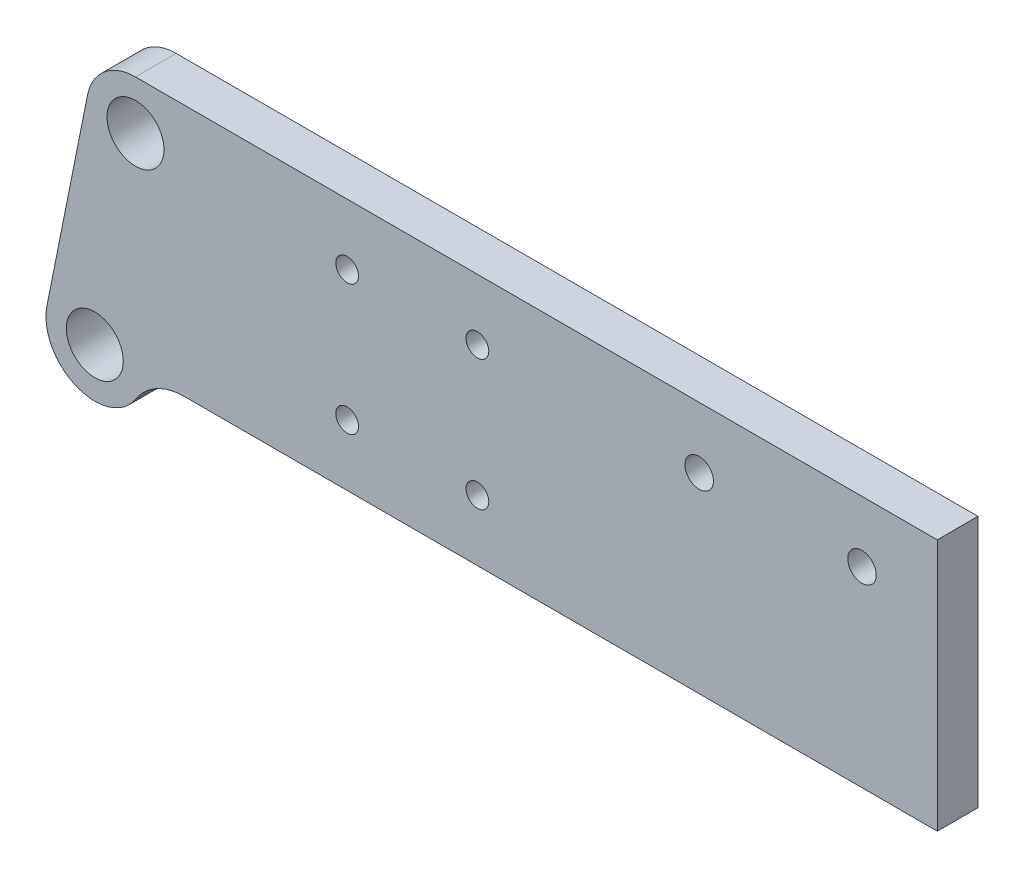
ISO-10303-21;
HEADER;
FILE_DESCRIPTION(('STEP AP214'),'2;1');
FILE_NAME('part.step','',(''),(''),'','','');
FILE_SCHEMA(('AUTOMOTIVE_DESIGN { 1 0 10303 214 1 1 1 1 }'));
ENDSEC;
DATA;
#1=APPLICATION_CONTEXT('core data for automotive mechanical design processes');
#2=APPLICATION_PROTOCOL_DEFINITION('international standard','automotive_design',2000,#1);
#3=PRODUCT_CONTEXT('',#1,'mechanical');
#4=PRODUCT('Part','Part','',(#3));
#5=PRODUCT_RELATED_PRODUCT_CATEGORY('part','',(#4));
#6=PRODUCT_DEFINITION_FORMATION('','',#4);
#7=PRODUCT_DEFINITION_CONTEXT('part definition',#1,'design');
#8=PRODUCT_DEFINITION('design','',#6,#7);
#9=PRODUCT_DEFINITION_SHAPE('','',#8);
#10=(LENGTH_UNIT() NAMED_UNIT(*) SI_UNIT(.MILLI.,.METRE.));
#11=(NAMED_UNIT(*) PLANE_ANGLE_UNIT() SI_UNIT($,.RADIAN.));
#12=(NAMED_UNIT(*) SI_UNIT($,.STERADIAN.) SOLID_ANGLE_UNIT());
#13=UNCERTAINTY_MEASURE_WITH_UNIT(LENGTH_MEASURE(1.E-05),#10,'distance_accuracy_value','');
#14=(GEOMETRIC_REPRESENTATION_CONTEXT(3) GLOBAL_UNCERTAINTY_ASSIGNED_CONTEXT((#13)) GLOBAL_UNIT_ASSIGNED_CONTEXT((#10,
#11,#12)) REPRESENTATION_CONTEXT('',''));
#15=CARTESIAN_POINT('',(0.,0.,0.));
#16=DIRECTION('',(0.,0.,1.));
#17=DIRECTION('',(1.,0.,0.));
#18=AXIS2_PLACEMENT_3D('',#15,#16,#17);
#19=CARTESIAN_POINT('',(64.5,-15.5,-5.));
#20=DIRECTION('',(1.,0.,0.));
#21=DIRECTION('',(0.,0.,-1.));
#22=AXIS2_PLACEMENT_3D('',#19,#20,#21);
#23=PLANE('',#22);
#24=DIRECTION('',(0.,1.,0.));
#25=VECTOR('',#24,1.);
#26=CARTESIAN_POINT('',(64.5,-15.5,0.));
#27=LINE('',#26,#25);
#28=CARTESIAN_POINT('',(64.5,-15.5,0.));
#29=VERTEX_POINT('',#28);
#30=CARTESIAN_POINT('',(64.5,15.5,0.));
#31=VERTEX_POINT('',#30);
#32=EDGE_CURVE('E126',#29,#31,#27,.T.);
#33=ORIENTED_EDGE('',*,*,#32,.F.);
#34=DIRECTION('',(0.,0.,1.));
#35=VECTOR('',#34,1.);
#36=CARTESIAN_POINT('',(64.5,-15.5,-5.));
#37=LINE('',#36,#35);
#38=CARTESIAN_POINT('',(64.5,-15.5,-5.));
#39=VERTEX_POINT('',#38);
#40=EDGE_CURVE('E11',#39,#29,#37,.T.);
#41=ORIENTED_EDGE('',*,*,#40,.F.);
#42=DIRECTION('',(0.,1.,0.));
#43=VECTOR('',#42,1.);
#44=CARTESIAN_POINT('',(64.5,-15.5,-5.));
#45=LINE('',#44,#43);
#46=CARTESIAN_POINT('',(64.5,15.5,-5.));
#47=VERTEX_POINT('',#46);
#48=EDGE_CURVE('E144',#39,#47,#45,.T.);
#49=ORIENTED_EDGE('',*,*,#48,.T.);
#50=DIRECTION('',(0.,0.,1.));
#51=VECTOR('',#50,1.);
#52=CARTESIAN_POINT('',(64.5,15.5,-5.));
#53=LINE('',#52,#51);
#54=EDGE_CURVE('E38',#47,#31,#53,.T.);
#55=ORIENTED_EDGE('',*,*,#54,.T.);
#56=EDGE_LOOP('',(#33,#41,#49,#55));
#57=FACE_BOUND('',#56,.T.);
#58=ADVANCED_FACE('F35',(#57),#23,.T.);
#59=CARTESIAN_POINT('',(-28.0455488498967,-15.5,-5.));
#60=DIRECTION('',(0.,-1.,0.));
#61=DIRECTION('',(1.,0.,0.));
#62=AXIS2_PLACEMENT_3D('',#59,#60,#61);
#63=PLANE('',#62);
#64=DIRECTION('',(1.,0.,0.));
#65=VECTOR('',#64,1.);
#66=CARTESIAN_POINT('',(-28.0455488498967,-15.5,0.));
#67=LINE('',#66,#65);
#68=CARTESIAN_POINT('',(-28.0455488498967,-15.5,0.));
#69=VERTEX_POINT('',#68);
#70=EDGE_CURVE('E142',#69,#29,#67,.T.);
#71=ORIENTED_EDGE('',*,*,#70,.F.);
#72=DIRECTION('',(0.,0.,1.));
#73=VECTOR('',#72,1.);
#74=CARTESIAN_POINT('',(-28.0455488498967,-15.5,-5.));
#75=LINE('',#74,#73);
#76=CARTESIAN_POINT('',(-28.0455488498967,-15.5,-5.));
#77=VERTEX_POINT('',#76);
#78=EDGE_CURVE('E44',#77,#69,#75,.T.);
#79=ORIENTED_EDGE('',*,*,#78,.F.);
#80=DIRECTION('',(1.,0.,0.));
#81=VECTOR('',#80,1.);
#82=CARTESIAN_POINT('',(-28.0455488498967,-15.5,-5.));
#83=LINE('',#82,#81);
#84=EDGE_CURVE('E116',#77,#39,#83,.T.);
#85=ORIENTED_EDGE('',*,*,#84,.T.);
#86=ORIENTED_EDGE('',*,*,#40,.T.);
#87=EDGE_LOOP('',(#71,#79,#85,#86));
#88=FACE_BOUND('',#87,.T.);
#89=ADVANCED_FACE('F154',(#88),#63,.T.);
#90=CARTESIAN_POINT('',(-28.0455488498967,-22.5,-5.));
#91=DIRECTION('',(0.,0.,1.));
#92=DIRECTION('',(1.,0.,0.));
#93=AXIS2_PLACEMENT_3D('',#90,#91,#92);
#94=CYLINDRICAL_SURFACE('',#93,7.);
#95=CARTESIAN_POINT('',(-28.0455488498967,-22.5,0.));
#96=DIRECTION('',(0.,0.,-1.));
#97=DIRECTION('',(1.,0.,0.));
#98=AXIS2_PLACEMENT_3D('',#95,#96,#97);
#99=CIRCLE('',#98,7.);
#100=CARTESIAN_POINT('',(-33.9440994691831,-18.7307692307692,0.));
#101=VERTEX_POINT('',#100);
#102=EDGE_CURVE('E103',#101,#69,#99,.T.);
#103=ORIENTED_EDGE('',*,*,#102,.F.);
#104=DIRECTION('',(0.,0.,1.));
#105=VECTOR('',#104,1.);
#106=CARTESIAN_POINT('',(-33.9440994691831,-18.7307692307692,-5.));
#107=LINE('',#106,#105);
#108=CARTESIAN_POINT('',(-33.9440994691831,-18.7307692307692,-5.));
#109=VERTEX_POINT('',#108);
#110=EDGE_CURVE('E98',#109,#101,#107,.T.);
#111=ORIENTED_EDGE('',*,*,#110,.F.);
#112=CARTESIAN_POINT('',(-28.0455488498967,-22.5,-5.));
#113=DIRECTION('',(0.,0.,-1.));
#114=DIRECTION('',(1.,0.,0.));
#115=AXIS2_PLACEMENT_3D('',#112,#113,#114);
#116=CIRCLE('',#115,7.);
#117=EDGE_CURVE('E101',#109,#77,#116,.T.);
#118=ORIENTED_EDGE('',*,*,#117,.T.);
#119=ORIENTED_EDGE('',*,*,#78,.T.);
#120=EDGE_LOOP('',(#103,#111,#118,#119));
#121=FACE_BOUND('',#120,.T.);
#122=ADVANCED_FACE('F100',(#121),#94,.F.);
#123=CARTESIAN_POINT('',(-39.,-15.5,-5.));
#124=DIRECTION('',(0.,0.,1.));
#125=DIRECTION('',(1.,0.,0.));
#126=AXIS2_PLACEMENT_3D('',#123,#124,#125);
#127=CYLINDRICAL_SURFACE('',#126,6.);
#128=CARTESIAN_POINT('',(-39.,-15.5,0.));
#129=DIRECTION('',(0.,0.,1.));
#130=DIRECTION('',(-1.,0.,0.));
#131=AXIS2_PLACEMENT_3D('',#128,#129,#130);
#132=CIRCLE('',#131,6.);
#133=CARTESIAN_POINT('',(-44.8834840541455,-14.3233031891709,0.));
#134=VERTEX_POINT('',#133);
#135=EDGE_CURVE('E139',#134,#101,#132,.T.);
#136=ORIENTED_EDGE('',*,*,#135,.F.);
#137=DIRECTION('',(0.,0.,1.));
#138=VECTOR('',#137,1.);
#139=CARTESIAN_POINT('',(-44.8834840541455,-14.3233031891709,-5.));
#140=LINE('',#139,#138);
#141=CARTESIAN_POINT('',(-44.8834840541455,-14.3233031891709,-5.));
#142=VERTEX_POINT('',#141);
#143=EDGE_CURVE('E108',#142,#134,#140,.T.);
#144=ORIENTED_EDGE('',*,*,#143,.F.);
#145=CARTESIAN_POINT('',(-39.,-15.5,-5.));
#146=DIRECTION('',(0.,0.,1.));
#147=DIRECTION('',(-1.,0.,0.));
#148=AXIS2_PLACEMENT_3D('',#145,#146,#147);
#149=CIRCLE('',#148,6.);
#150=EDGE_CURVE('E114',#142,#109,#149,.T.);
#151=ORIENTED_EDGE('',*,*,#150,.T.);
#152=ORIENTED_EDGE('',*,*,#110,.T.);
#153=EDGE_LOOP('',(#136,#144,#151,#152));
#154=FACE_BOUND('',#153,.T.);
#155=ADVANCED_FACE('F118',(#154),#127,.T.);
#156=CARTESIAN_POINT('',(-44.8834840541455,-14.3233031891709,-5.));
#157=DIRECTION('',(-0.98058067569092,0.196116135138184,0.));
#158=DIRECTION('',(-0.196116135138184,-0.98058067569092,0.));
#159=AXIS2_PLACEMENT_3D('',#156,#157,#158);
#160=PLANE('',#159);
#161=DIRECTION('',(-0.196116135138184,-0.98058067569092,0.));
#162=VECTOR('',#161,1.);
#163=CARTESIAN_POINT('',(-44.8834840541455,-14.3233031891709,0.));
#164=LINE('',#163,#162);
#165=CARTESIAN_POINT('',(-39.8834840541455,10.6766968108291,0.));
#166=VERTEX_POINT('',#165);
#167=EDGE_CURVE('E136',#166,#134,#164,.T.);
#168=ORIENTED_EDGE('',*,*,#167,.F.);
#169=DIRECTION('',(0.,0.,1.));
#170=VECTOR('',#169,1.);
#171=CARTESIAN_POINT('',(-39.8834840541455,10.6766968108291,-5.));
#172=LINE('',#171,#170);
#173=CARTESIAN_POINT('',(-39.8834840541455,10.6766968108291,-5.));
#174=VERTEX_POINT('',#173);
#175=EDGE_CURVE('E148',#174,#166,#172,.T.);
#176=ORIENTED_EDGE('',*,*,#175,.F.);
#177=DIRECTION('',(-0.196116135138184,-0.98058067569092,0.));
#178=VECTOR('',#177,1.);
#179=CARTESIAN_POINT('',(-44.8834840541455,-14.3233031891709,-5.));
#180=LINE('',#179,#178);
#181=EDGE_CURVE('E119',#174,#142,#180,.T.);
#182=ORIENTED_EDGE('',*,*,#181,.T.);
#183=ORIENTED_EDGE('',*,*,#143,.T.);
#184=EDGE_LOOP('',(#168,#176,#182,#183));
#185=FACE_BOUND('',#184,.T.);
#186=ADVANCED_FACE('F167',(#185),#160,.T.);
#187=CARTESIAN_POINT('',(-34.,9.5,-5.));
#188=DIRECTION('',(0.,0.,1.));
#189=DIRECTION('',(1.,0.,0.));
#190=AXIS2_PLACEMENT_3D('',#187,#188,#189);
#191=CYLINDRICAL_SURFACE('',#190,6.);
#192=CARTESIAN_POINT('',(-34.,9.5,0.));
#193=DIRECTION('',(0.,0.,1.));
#194=DIRECTION('',(1.,0.,0.));
#195=AXIS2_PLACEMENT_3D('',#192,#193,#194);
#196=CIRCLE('',#195,6.);
#197=CARTESIAN_POINT('',(-34.,15.5,0.));
#198=VERTEX_POINT('',#197);
#199=EDGE_CURVE('E133',#198,#166,#196,.T.);
#200=ORIENTED_EDGE('',*,*,#199,.F.);
#201=DIRECTION('',(0.,0.,1.));
#202=VECTOR('',#201,1.);
#203=CARTESIAN_POINT('',(-34.,15.5,-5.));
#204=LINE('',#203,#202);
#205=CARTESIAN_POINT('',(-34.,15.5,-5.));
#206=VERTEX_POINT('',#205);
#207=EDGE_CURVE('E149',#206,#198,#204,.T.);
#208=ORIENTED_EDGE('',*,*,#207,.F.);
#209=CARTESIAN_POINT('',(-34.,9.5,-5.));
#210=DIRECTION('',(0.,0.,1.));
#211=DIRECTION('',(1.,0.,0.));
#212=AXIS2_PLACEMENT_3D('',#209,#210,#211);
#213=CIRCLE('',#212,6.);
#214=EDGE_CURVE('E121',#206,#174,#213,.T.);
#215=ORIENTED_EDGE('',*,*,#214,.T.);
#216=ORIENTED_EDGE('',*,*,#175,.T.);
#217=EDGE_LOOP('',(#200,#208,#215,#216));
#218=FACE_BOUND('',#217,.T.);
#219=ADVANCED_FACE('F170',(#218),#191,.T.);
#220=CARTESIAN_POINT('',(-34.,15.5,-5.));
#221=DIRECTION('',(0.,1.,0.));
#222=DIRECTION('',(-1.,0.,0.));
#223=AXIS2_PLACEMENT_3D('',#220,#221,#222);
#224=PLANE('',#223);
#225=DIRECTION('',(-1.,0.,0.));
#226=VECTOR('',#225,1.);
#227=CARTESIAN_POINT('',(-34.,15.5,0.));
#228=LINE('',#227,#226);
#229=EDGE_CURVE('E129',#31,#198,#228,.T.);
#230=ORIENTED_EDGE('',*,*,#229,.F.);
#231=ORIENTED_EDGE('',*,*,#54,.F.);
#232=DIRECTION('',(-1.,0.,0.));
#233=VECTOR('',#232,1.);
#234=CARTESIAN_POINT('',(-34.,15.5,-5.));
#235=LINE('',#234,#233);
#236=EDGE_CURVE('E270',#47,#206,#235,.T.);
#237=ORIENTED_EDGE('',*,*,#236,.T.);
#238=ORIENTED_EDGE('',*,*,#207,.T.);
#239=EDGE_LOOP('',(#230,#231,#237,#238));
#240=FACE_BOUND('',#239,.T.);
#241=ADVANCED_FACE('F151',(#240),#224,.T.);
#242=CARTESIAN_POINT('',(-34.,9.5,-5.));
#243=DIRECTION('',(0.,0.,1.));
#244=DIRECTION('',(1.,0.,0.));
#245=AXIS2_PLACEMENT_3D('',#242,#243,#244);
#246=PLANE('',#245);
#247=CARTESIAN_POINT('',(55.25,8.,-5.));
#248=DIRECTION('',(0.,0.,1.));
#249=DIRECTION('',(1.,0.,0.));
#250=AXIS2_PLACEMENT_3D('',#247,#248,#249);
#251=CIRCLE('',#250,1.75);
#252=CARTESIAN_POINT('',(57.,8.,-5.));
#253=VERTEX_POINT('',#252);
#254=EDGE_CURVE('E221',#253,#253,#251,.T.);
#255=ORIENTED_EDGE('',*,*,#254,.T.);
#256=EDGE_LOOP('',(#255));
#257=FACE_BOUND('',#256,.T.);
#258=CARTESIAN_POINT('',(35.25,8.,-5.));
#259=DIRECTION('',(0.,0.,1.));
#260=DIRECTION('',(1.,0.,0.));
#261=AXIS2_PLACEMENT_3D('',#258,#259,#260);
#262=CIRCLE('',#261,1.75);
#263=CARTESIAN_POINT('',(37.,8.,-5.));
#264=VERTEX_POINT('',#263);
#265=EDGE_CURVE('E229',#264,#264,#262,.T.);
#266=ORIENTED_EDGE('',*,*,#265,.T.);
#267=EDGE_LOOP('',(#266));
#268=FACE_BOUND('',#267,.T.);
#269=CARTESIAN_POINT('',(-34.,9.5,-5.));
#270=DIRECTION('',(0.,0.,1.));
#271=DIRECTION('',(1.,0.,0.));
#272=AXIS2_PLACEMENT_3D('',#269,#270,#271);
#273=CIRCLE('',#272,3.5);
#274=CARTESIAN_POINT('',(-30.5,9.5,-5.));
#275=VERTEX_POINT('',#274);
#276=EDGE_CURVE('E235',#275,#275,#273,.T.);
#277=ORIENTED_EDGE('',*,*,#276,.T.);
#278=EDGE_LOOP('',(#277));
#279=FACE_BOUND('',#278,.T.);
#280=CARTESIAN_POINT('',(-39.,-15.5,-5.));
#281=DIRECTION('',(0.,0.,1.));
#282=DIRECTION('',(1.,0.,0.));
#283=AXIS2_PLACEMENT_3D('',#280,#281,#282);
#284=CIRCLE('',#283,3.5);
#285=CARTESIAN_POINT('',(-35.5,-15.5,-5.));
#286=VERTEX_POINT('',#285);
#287=EDGE_CURVE('E241',#286,#286,#284,.T.);
#288=ORIENTED_EDGE('',*,*,#287,.T.);
#289=EDGE_LOOP('',(#288));
#290=FACE_BOUND('',#289,.T.);
#291=CARTESIAN_POINT('',(-8.,-8.,-5.));
#292=DIRECTION('',(0.,0.,1.));
#293=DIRECTION('',(1.,0.,0.));
#294=AXIS2_PLACEMENT_3D('',#291,#292,#293);
#295=CIRCLE('',#294,1.4);
#296=CARTESIAN_POINT('',(-6.6,-8.,-5.));
#297=VERTEX_POINT('',#296);
#298=EDGE_CURVE('E247',#297,#297,#295,.T.);
#299=ORIENTED_EDGE('',*,*,#298,.T.);
#300=EDGE_LOOP('',(#299));
#301=FACE_BOUND('',#300,.T.);
#302=CARTESIAN_POINT('',(8.,-8.,-5.));
#303=DIRECTION('',(0.,0.,1.));
#304=DIRECTION('',(1.,0.,0.));
#305=AXIS2_PLACEMENT_3D('',#302,#303,#304);
#306=CIRCLE('',#305,1.4);
#307=CARTESIAN_POINT('',(9.4,-8.,-5.));
#308=VERTEX_POINT('',#307);
#309=EDGE_CURVE('E253',#308,#308,#306,.T.);
#310=ORIENTED_EDGE('',*,*,#309,.T.);
#311=EDGE_LOOP('',(#310));
#312=FACE_BOUND('',#311,.T.);
#313=CARTESIAN_POINT('',(8.,8.,-5.));
#314=DIRECTION('',(0.,0.,1.));
#315=DIRECTION('',(1.,0.,0.));
#316=AXIS2_PLACEMENT_3D('',#313,#314,#315);
#317=CIRCLE('',#316,1.4);
#318=CARTESIAN_POINT('',(9.4,8.,-5.));
#319=VERTEX_POINT('',#318);
#320=EDGE_CURVE('E259',#319,#319,#317,.T.);
#321=ORIENTED_EDGE('',*,*,#320,.T.);
#322=EDGE_LOOP('',(#321));
#323=FACE_BOUND('',#322,.T.);
#324=CARTESIAN_POINT('',(-8.,8.,-5.));
#325=DIRECTION('',(0.,0.,1.));
#326=DIRECTION('',(1.,0.,0.));
#327=AXIS2_PLACEMENT_3D('',#324,#325,#326);
#328=CIRCLE('',#327,1.4);
#329=CARTESIAN_POINT('',(-6.6,8.,-5.));
#330=VERTEX_POINT('',#329);
#331=EDGE_CURVE('E130',#330,#330,#328,.T.);
#332=ORIENTED_EDGE('',*,*,#331,.T.);
#333=EDGE_LOOP('',(#332));
#334=FACE_BOUND('',#333,.T.);
#335=ORIENTED_EDGE('',*,*,#48,.F.);
#336=ORIENTED_EDGE('',*,*,#84,.F.);
#337=ORIENTED_EDGE('',*,*,#117,.F.);
#338=ORIENTED_EDGE('',*,*,#150,.F.);
#339=ORIENTED_EDGE('',*,*,#181,.F.);
#340=ORIENTED_EDGE('',*,*,#214,.F.);
#341=ORIENTED_EDGE('',*,*,#236,.F.);
#342=EDGE_LOOP('',(#335,#336,#337,#338,#339,#340,#341));
#343=FACE_BOUND('',#342,.T.);
#344=ADVANCED_FACE('F112',(#257,#268,#279,#290,#301,#312,#323,#334,#343),#246,.F.);
#345=CARTESIAN_POINT('',(-34.,9.5,0.));
#346=DIRECTION('',(0.,0.,1.));
#347=DIRECTION('',(1.,0.,0.));
#348=AXIS2_PLACEMENT_3D('',#345,#346,#347);
#349=PLANE('',#348);
#350=CARTESIAN_POINT('',(55.25,8.,0.));
#351=DIRECTION('',(0.,0.,1.));
#352=DIRECTION('',(1.,0.,0.));
#353=AXIS2_PLACEMENT_3D('',#350,#351,#352);
#354=CIRCLE('',#353,1.75);
#355=CARTESIAN_POINT('',(57.,8.,0.));
#356=VERTEX_POINT('',#355);
#357=EDGE_CURVE('E224',#356,#356,#354,.T.);
#358=ORIENTED_EDGE('',*,*,#357,.F.);
#359=EDGE_LOOP('',(#358));
#360=FACE_BOUND('',#359,.T.);
#361=CARTESIAN_POINT('',(35.25,8.,0.));
#362=DIRECTION('',(0.,0.,1.));
#363=DIRECTION('',(1.,0.,0.));
#364=AXIS2_PLACEMENT_3D('',#361,#362,#363);
#365=CIRCLE('',#364,1.75);
#366=CARTESIAN_POINT('',(37.,8.,0.));
#367=VERTEX_POINT('',#366);
#368=EDGE_CURVE('E226',#367,#367,#365,.T.);
#369=ORIENTED_EDGE('',*,*,#368,.F.);
#370=EDGE_LOOP('',(#369));
#371=FACE_BOUND('',#370,.T.);
#372=CARTESIAN_POINT('',(-34.,9.5,0.));
#373=DIRECTION('',(0.,0.,1.));
#374=DIRECTION('',(1.,0.,0.));
#375=AXIS2_PLACEMENT_3D('',#372,#373,#374);
#376=CIRCLE('',#375,3.5);
#377=CARTESIAN_POINT('',(-30.5,9.5,0.));
#378=VERTEX_POINT('',#377);
#379=EDGE_CURVE('E232',#378,#378,#376,.T.);
#380=ORIENTED_EDGE('',*,*,#379,.F.);
#381=EDGE_LOOP('',(#380));
#382=FACE_BOUND('',#381,.T.);
#383=CARTESIAN_POINT('',(-39.,-15.5,0.));
#384=DIRECTION('',(0.,0.,1.));
#385=DIRECTION('',(1.,0.,0.));
#386=AXIS2_PLACEMENT_3D('',#383,#384,#385);
#387=CIRCLE('',#386,3.5);
#388=CARTESIAN_POINT('',(-35.5,-15.5,0.));
#389=VERTEX_POINT('',#388);
#390=EDGE_CURVE('E238',#389,#389,#387,.T.);
#391=ORIENTED_EDGE('',*,*,#390,.F.);
#392=EDGE_LOOP('',(#391));
#393=FACE_BOUND('',#392,.T.);
#394=CARTESIAN_POINT('',(-8.,-8.,0.));
#395=DIRECTION('',(0.,0.,1.));
#396=DIRECTION('',(1.,0.,0.));
#397=AXIS2_PLACEMENT_3D('',#394,#395,#396);
#398=CIRCLE('',#397,1.4);
#399=CARTESIAN_POINT('',(-6.6,-8.,0.));
#400=VERTEX_POINT('',#399);
#401=EDGE_CURVE('E244',#400,#400,#398,.T.);
#402=ORIENTED_EDGE('',*,*,#401,.F.);
#403=EDGE_LOOP('',(#402));
#404=FACE_BOUND('',#403,.T.);
#405=CARTESIAN_POINT('',(8.,-8.,0.));
#406=DIRECTION('',(0.,0.,1.));
#407=DIRECTION('',(1.,0.,0.));
#408=AXIS2_PLACEMENT_3D('',#405,#406,#407);
#409=CIRCLE('',#408,1.4);
#410=CARTESIAN_POINT('',(9.4,-8.,0.));
#411=VERTEX_POINT('',#410);
#412=EDGE_CURVE('E250',#411,#411,#409,.T.);
#413=ORIENTED_EDGE('',*,*,#412,.F.);
#414=EDGE_LOOP('',(#413));
#415=FACE_BOUND('',#414,.T.);
#416=CARTESIAN_POINT('',(8.,8.,0.));
#417=DIRECTION('',(0.,0.,1.));
#418=DIRECTION('',(1.,0.,0.));
#419=AXIS2_PLACEMENT_3D('',#416,#417,#418);
#420=CIRCLE('',#419,1.4);
#421=CARTESIAN_POINT('',(9.4,8.,0.));
#422=VERTEX_POINT('',#421);
#423=EDGE_CURVE('E256',#422,#422,#420,.T.);
#424=ORIENTED_EDGE('',*,*,#423,.F.);
#425=EDGE_LOOP('',(#424));
#426=FACE_BOUND('',#425,.T.);
#427=CARTESIAN_POINT('',(-8.,8.,0.));
#428=DIRECTION('',(0.,0.,1.));
#429=DIRECTION('',(1.,0.,0.));
#430=AXIS2_PLACEMENT_3D('',#427,#428,#429);
#431=CIRCLE('',#430,1.4);
#432=CARTESIAN_POINT('',(-6.6,8.,0.));
#433=VERTEX_POINT('',#432);
#434=EDGE_CURVE('E262',#433,#433,#431,.T.);
#435=ORIENTED_EDGE('',*,*,#434,.F.);
#436=EDGE_LOOP('',(#435));
#437=FACE_BOUND('',#436,.T.);
#438=ORIENTED_EDGE('',*,*,#32,.T.);
#439=ORIENTED_EDGE('',*,*,#229,.T.);
#440=ORIENTED_EDGE('',*,*,#199,.T.);
#441=ORIENTED_EDGE('',*,*,#167,.T.);
#442=ORIENTED_EDGE('',*,*,#135,.T.);
#443=ORIENTED_EDGE('',*,*,#102,.T.);
#444=ORIENTED_EDGE('',*,*,#70,.T.);
#445=EDGE_LOOP('',(#438,#439,#440,#441,#442,#443,#444));
#446=FACE_BOUND('',#445,.T.);
#447=ADVANCED_FACE('F153',(#360,#371,#382,#393,#404,#415,#426,#437,#446),#349,.T.);
#448=CARTESIAN_POINT('',(-8.,8.,-5.));
#449=DIRECTION('',(0.,0.,1.));
#450=DIRECTION('',(1.,0.,0.));
#451=AXIS2_PLACEMENT_3D('',#448,#449,#450);
#452=CYLINDRICAL_SURFACE('',#451,1.4);
#453=ORIENTED_EDGE('',*,*,#331,.F.);
#454=EDGE_LOOP('',(#453));
#455=FACE_BOUND('',#454,.T.);
#456=ORIENTED_EDGE('',*,*,#434,.T.);
#457=EDGE_LOOP('',(#456));
#458=FACE_BOUND('',#457,.T.);
#459=ADVANCED_FACE('F182',(#455,#458),#452,.F.);
#460=CARTESIAN_POINT('',(8.,8.,-5.));
#461=DIRECTION('',(0.,0.,1.));
#462=DIRECTION('',(1.,0.,0.));
#463=AXIS2_PLACEMENT_3D('',#460,#461,#462);
#464=CYLINDRICAL_SURFACE('',#463,1.4);
#465=ORIENTED_EDGE('',*,*,#320,.F.);
#466=EDGE_LOOP('',(#465));
#467=FACE_BOUND('',#466,.T.);
#468=ORIENTED_EDGE('',*,*,#423,.T.);
#469=EDGE_LOOP('',(#468));
#470=FACE_BOUND('',#469,.T.);
#471=ADVANCED_FACE('F189',(#467,#470),#464,.F.);
#472=CARTESIAN_POINT('',(8.,-8.,-5.));
#473=DIRECTION('',(0.,0.,1.));
#474=DIRECTION('',(1.,0.,0.));
#475=AXIS2_PLACEMENT_3D('',#472,#473,#474);
#476=CYLINDRICAL_SURFACE('',#475,1.4);
#477=ORIENTED_EDGE('',*,*,#309,.F.);
#478=EDGE_LOOP('',(#477));
#479=FACE_BOUND('',#478,.T.);
#480=ORIENTED_EDGE('',*,*,#412,.T.);
#481=EDGE_LOOP('',(#480));
#482=FACE_BOUND('',#481,.T.);
#483=ADVANCED_FACE('F193',(#479,#482),#476,.F.);
#484=CARTESIAN_POINT('',(-8.,-8.,-5.));
#485=DIRECTION('',(0.,0.,1.));
#486=DIRECTION('',(1.,0.,0.));
#487=AXIS2_PLACEMENT_3D('',#484,#485,#486);
#488=CYLINDRICAL_SURFACE('',#487,1.4);
#489=ORIENTED_EDGE('',*,*,#298,.F.);
#490=EDGE_LOOP('',(#489));
#491=FACE_BOUND('',#490,.T.);
#492=ORIENTED_EDGE('',*,*,#401,.T.);
#493=EDGE_LOOP('',(#492));
#494=FACE_BOUND('',#493,.T.);
#495=ADVANCED_FACE('F197',(#491,#494),#488,.F.);
#496=CARTESIAN_POINT('',(-39.,-15.5,-5.));
#497=DIRECTION('',(0.,0.,1.));
#498=DIRECTION('',(1.,0.,0.));
#499=AXIS2_PLACEMENT_3D('',#496,#497,#498);
#500=CYLINDRICAL_SURFACE('',#499,3.5);
#501=ORIENTED_EDGE('',*,*,#287,.F.);
#502=EDGE_LOOP('',(#501));
#503=FACE_BOUND('',#502,.T.);
#504=ORIENTED_EDGE('',*,*,#390,.T.);
#505=EDGE_LOOP('',(#504));
#506=FACE_BOUND('',#505,.T.);
#507=ADVANCED_FACE('F201',(#503,#506),#500,.F.);
#508=CARTESIAN_POINT('',(-34.,9.5,-5.));
#509=DIRECTION('',(0.,0.,1.));
#510=DIRECTION('',(1.,0.,0.));
#511=AXIS2_PLACEMENT_3D('',#508,#509,#510);
#512=CYLINDRICAL_SURFACE('',#511,3.5);
#513=ORIENTED_EDGE('',*,*,#276,.F.);
#514=EDGE_LOOP('',(#513));
#515=FACE_BOUND('',#514,.T.);
#516=ORIENTED_EDGE('',*,*,#379,.T.);
#517=EDGE_LOOP('',(#516));
#518=FACE_BOUND('',#517,.T.);
#519=ADVANCED_FACE('F205',(#515,#518),#512,.F.);
#520=CARTESIAN_POINT('',(35.25,8.,-5.));
#521=DIRECTION('',(0.,0.,1.));
#522=DIRECTION('',(1.,0.,0.));
#523=AXIS2_PLACEMENT_3D('',#520,#521,#522);
#524=CYLINDRICAL_SURFACE('',#523,1.75);
#525=ORIENTED_EDGE('',*,*,#265,.F.);
#526=EDGE_LOOP('',(#525));
#527=FACE_BOUND('',#526,.T.);
#528=ORIENTED_EDGE('',*,*,#368,.T.);
#529=EDGE_LOOP('',(#528));
#530=FACE_BOUND('',#529,.T.);
#531=ADVANCED_FACE('F209',(#527,#530),#524,.F.);
#532=CARTESIAN_POINT('',(55.25,8.,-5.));
#533=DIRECTION('',(0.,0.,1.));
#534=DIRECTION('',(1.,0.,0.));
#535=AXIS2_PLACEMENT_3D('',#532,#533,#534);
#536=CYLINDRICAL_SURFACE('',#535,1.75);
#537=ORIENTED_EDGE('',*,*,#254,.F.);
#538=EDGE_LOOP('',(#537));
#539=FACE_BOUND('',#538,.T.);
#540=ORIENTED_EDGE('',*,*,#357,.T.);
#541=EDGE_LOOP('',(#540));
#542=FACE_BOUND('',#541,.T.);
#543=ADVANCED_FACE('F213',(#539,#542),#536,.F.);
#544=CLOSED_SHELL('',(#58,#89,#122,#155,#186,#219,#241,#344,#447,#459,#471,#483,#495,#507,#519,
#531,#543));
#545=MANIFOLD_SOLID_BREP('B2',#544);
#546=ADVANCED_BREP_SHAPE_REPRESENTATION('',(#18,#545),#14);
#547=SHAPE_DEFINITION_REPRESENTATION(#9,#546);
ENDSEC;
END-ISO-10303-21;
